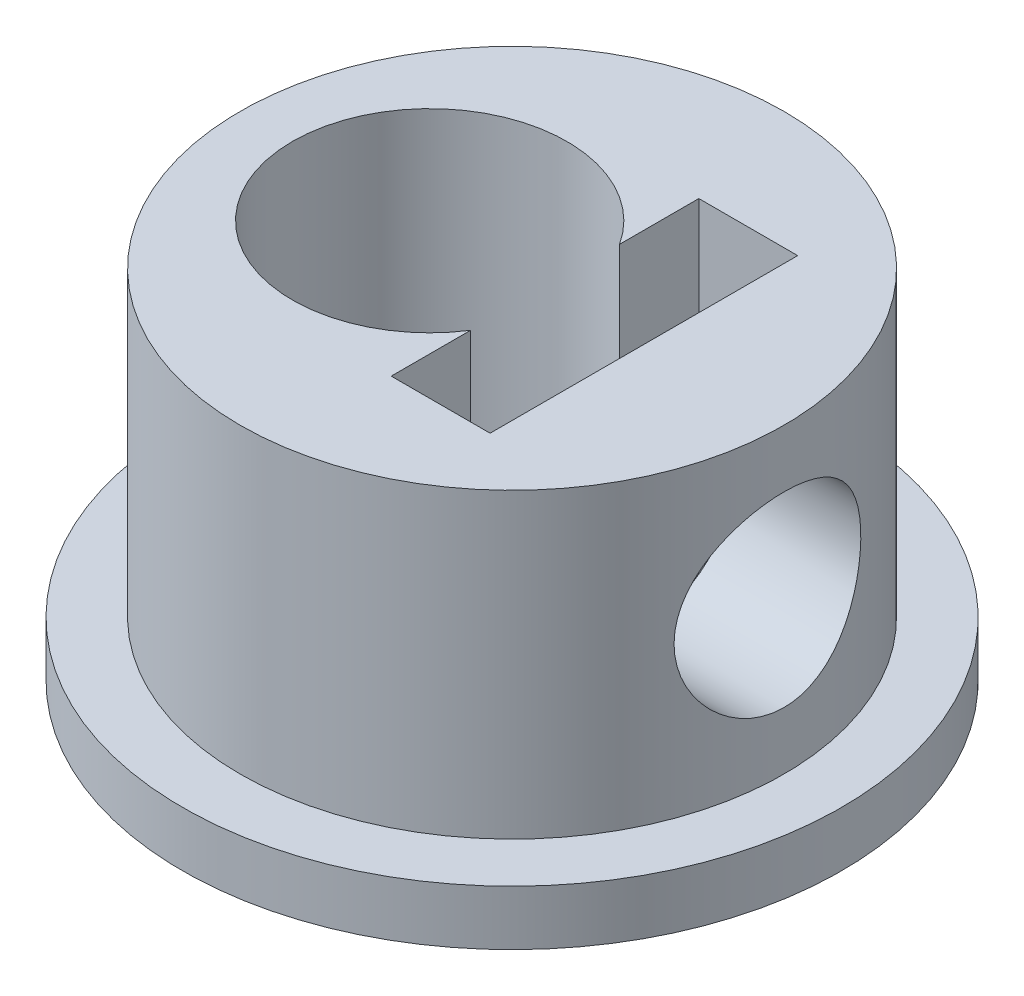
ISO-10303-21;
HEADER;
FILE_DESCRIPTION(('STEP AP214'),'2;1');
FILE_NAME('part.step','',(''),(''),'','','');
FILE_SCHEMA(('AUTOMOTIVE_DESIGN { 1 0 10303 214 1 1 1 1 }'));
ENDSEC;
DATA;
#1=APPLICATION_CONTEXT('core data for automotive mechanical design processes');
#2=APPLICATION_PROTOCOL_DEFINITION('international standard','automotive_design',2000,#1);
#3=PRODUCT_CONTEXT('',#1,'mechanical');
#4=PRODUCT('Part','Part','',(#3));
#5=PRODUCT_RELATED_PRODUCT_CATEGORY('part','',(#4));
#6=PRODUCT_DEFINITION_FORMATION('','',#4);
#7=PRODUCT_DEFINITION_CONTEXT('part definition',#1,'design');
#8=PRODUCT_DEFINITION('design','',#6,#7);
#9=PRODUCT_DEFINITION_SHAPE('','',#8);
#10=(LENGTH_UNIT() NAMED_UNIT(*) SI_UNIT(.MILLI.,.METRE.));
#11=(NAMED_UNIT(*) PLANE_ANGLE_UNIT() SI_UNIT($,.RADIAN.));
#12=(NAMED_UNIT(*) SI_UNIT($,.STERADIAN.) SOLID_ANGLE_UNIT());
#13=UNCERTAINTY_MEASURE_WITH_UNIT(LENGTH_MEASURE(1.E-05),#10,'distance_accuracy_value','');
#14=(GEOMETRIC_REPRESENTATION_CONTEXT(3) GLOBAL_UNCERTAINTY_ASSIGNED_CONTEXT((#13)) GLOBAL_UNIT_ASSIGNED_CONTEXT((#10,
#11,#12)) REPRESENTATION_CONTEXT('',''));
#15=CARTESIAN_POINT('',(0.,0.,0.));
#16=DIRECTION('',(0.,0.,1.));
#17=DIRECTION('',(1.,0.,0.));
#18=AXIS2_PLACEMENT_3D('',#15,#16,#17);
#19=CARTESIAN_POINT('',(2.1,26.3821764679411,2.8));
#20=DIRECTION('',(-1.,0.,0.));
#21=DIRECTION('',(0.,0.,1.));
#22=AXIS2_PLACEMENT_3D('',#19,#20,#21);
#23=PLANE('',#22);
#24=DIRECTION('',(0.,0.,-1.));
#25=VECTOR('',#24,1.);
#26=CARTESIAN_POINT('',(2.1,20.5,2.8));
#27=LINE('',#26,#25);
#28=CARTESIAN_POINT('',(2.1,20.5,-1.35646599662505));
#29=VERTEX_POINT('',#28);
#30=CARTESIAN_POINT('',(2.1,20.5,-2.8));
#31=VERTEX_POINT('',#30);
#32=EDGE_CURVE('E96',#29,#31,#27,.T.);
#33=ORIENTED_EDGE('',*,*,#32,.F.);
#34=DIRECTION('',(0.,-1.,0.));
#35=VECTOR('',#34,1.);
#36=CARTESIAN_POINT('',(2.1,20.5,-1.35646599662505));
#37=LINE('',#36,#35);
#38=CARTESIAN_POINT('',(2.1,14.,-1.35646599662505));
#39=VERTEX_POINT('',#38);
#40=EDGE_CURVE('E46',#29,#39,#37,.T.);
#41=ORIENTED_EDGE('',*,*,#40,.T.);
#42=DIRECTION('',(0.,0.,-1.));
#43=VECTOR('',#42,1.);
#44=CARTESIAN_POINT('',(2.1,14.,-1.35646599662505));
#45=LINE('',#44,#43);
#46=CARTESIAN_POINT('',(2.1,14.,-2.8));
#47=VERTEX_POINT('',#46);
#48=EDGE_CURVE('E94',#39,#47,#45,.T.);
#49=ORIENTED_EDGE('',*,*,#48,.T.);
#50=DIRECTION('',(0.,-1.,0.));
#51=VECTOR('',#50,1.);
#52=CARTESIAN_POINT('',(2.1,26.3821764679411,-2.8));
#53=LINE('',#52,#51);
#54=EDGE_CURVE('E141',#31,#47,#53,.T.);
#55=ORIENTED_EDGE('',*,*,#54,.F.);
#56=EDGE_LOOP('',(#33,#41,#49,#55));
#57=FACE_BOUND('',#56,.T.);
#58=ADVANCED_FACE('F33',(#57),#23,.F.);
#59=CARTESIAN_POINT('',(1.5,20.5,0.));
#60=DIRECTION('',(0.,-1.,0.));
#61=DIRECTION('',(0.,0.,-1.));
#62=AXIS2_PLACEMENT_3D('',#59,#60,#61);
#63=CYLINDRICAL_SURFACE('',#62,4.95);
#64=CARTESIAN_POINT('',(6.45,16.05,0.));
#65=CARTESIAN_POINT('',(6.45000069370142,16.0499989798399,0.092596429513226));
#66=CARTESIAN_POINT('',(6.44737813284091,16.0575897978011,0.185185670024593));
#67=CARTESIAN_POINT('',(6.43717535980457,16.0876527224191,0.367627365291267));
#68=CARTESIAN_POINT('',(6.42959493116856,16.1101254788209,0.457479700374191));
#69=CARTESIAN_POINT('',(6.41029780757027,16.1690843806396,0.631791103056447));
#70=CARTESIAN_POINT('',(6.39858828303766,16.2055462427121,0.71625922232293));
#71=CARTESIAN_POINT('',(6.37222131099333,16.2913353579994,0.877880006838769));
#72=CARTESIAN_POINT('',(6.35756322777972,16.3406653862405,0.955031089266111));
#73=CARTESIAN_POINT('',(6.32623675407634,16.4526789666225,1.10264337621929));
#74=CARTESIAN_POINT('',(6.30951809156585,16.5157484444016,1.17280098627916));
#75=CARTESIAN_POINT('',(6.27622427238612,16.6526305175334,1.30177843985447));
#76=CARTESIAN_POINT('',(6.25964915087896,16.7264456704673,1.36059557645195));
#77=CARTESIAN_POINT('',(6.22795876261535,16.885510693191,1.46700047607617));
#78=CARTESIAN_POINT('',(6.21290432882619,16.9710431321208,1.5141857064657));
#79=CARTESIAN_POINT('',(6.18672836691681,17.1494298419942,1.59337043783226));
#80=CARTESIAN_POINT('',(6.1756055541467,17.2422817091776,1.62537490026795));
#81=CARTESIAN_POINT('',(6.15908340545217,17.4292076879648,1.67213664204263));
#82=CARTESIAN_POINT('',(6.15349503542264,17.5231216020063,1.68746546272729));
#83=CARTESIAN_POINT('',(6.14811662727282,17.7123419508981,1.70222780841535));
#84=CARTESIAN_POINT('',(6.14832466478679,17.8076479130961,1.70166660879053));
#85=CARTESIAN_POINT('',(6.15435052254945,17.9919941335364,1.68510700611931));
#86=CARTESIAN_POINT('',(6.15989352709647,18.0811128882059,1.66986482389371));
#87=CARTESIAN_POINT('',(6.17551343933726,18.2554414796757,1.62561341003419));
#88=CARTESIAN_POINT('',(6.18559092132817,18.340650819837,1.59660243454024));
#89=CARTESIAN_POINT('',(6.20933285789689,18.506418241684,1.52516105728235));
#90=CARTESIAN_POINT('',(6.22305477376428,18.5868740299714,1.48251322704317));
#91=CARTESIAN_POINT('',(6.25251653545097,18.7397216127519,1.38515976008882));
#92=CARTESIAN_POINT('',(6.26825699177138,18.8121109551438,1.33045047180914));
#93=CARTESIAN_POINT('',(6.3010525417767,18.9510061333229,1.20693520802176));
#94=CARTESIAN_POINT('',(6.31813205198042,19.0169604928795,1.13751425415935));
#95=CARTESIAN_POINT('',(6.35091825106323,19.1364399225024,0.988389373888792));
#96=CARTESIAN_POINT('',(6.36662479144719,19.1899636491541,0.908684337496531));
#97=CARTESIAN_POINT('',(6.39512419125182,19.2835432996544,0.740029542582821));
#98=CARTESIAN_POINT('',(6.40788278371196,19.3234431816121,0.650987011249475));
#99=CARTESIAN_POINT('',(6.42879893938599,19.3875235440451,0.466909537165199));
#100=CARTESIAN_POINT('',(6.43695820346475,19.411709836025,0.371876824100799));
#101=CARTESIAN_POINT('',(6.44747057679864,19.4426802537318,0.183178965471971));
#102=CARTESIAN_POINT('',(6.45007191719742,19.4502089367143,0.0896496963212941));
#103=CARTESIAN_POINT('',(6.44992508075,19.4497823219202,-0.0973595918798174));
#104=CARTESIAN_POINT('',(6.4471778702919,19.4418298213185,-0.190839616775248));
#105=CARTESIAN_POINT('',(6.43680662035375,19.4112508485353,-0.372061911656081));
#106=CARTESIAN_POINT('',(6.42933692904941,19.3890884937086,-0.459892210673393));
#107=CARTESIAN_POINT('',(6.41042641653269,19.3313063105564,-0.630546831880474));
#108=CARTESIAN_POINT('',(6.39898508386593,19.295684748948,-0.713370507720791));
#109=CARTESIAN_POINT('',(6.37289896440764,19.2109277644608,-0.874170736826442));
#110=CARTESIAN_POINT('',(6.35817562544958,19.161451643662,-0.951954595906774));
#111=CARTESIAN_POINT('',(6.32718626709556,19.0507863596591,-1.09835392155126));
#112=CARTESIAN_POINT('',(6.31091975231965,18.9895934287403,-1.16696642684554));
#113=CARTESIAN_POINT('',(6.27767634213329,18.8537341265165,-1.29653421147232));
#114=CARTESIAN_POINT('',(6.2607031512487,18.7785591491072,-1.35695845566415));
#115=CARTESIAN_POINT('',(6.22875865252161,18.6187772271138,-1.46440906300595));
#116=CARTESIAN_POINT('',(6.21378739211506,18.53417005912,-1.51143510871406));
#117=CARTESIAN_POINT('',(6.18767351162391,18.3577592334269,-1.59058566150042));
#118=CARTESIAN_POINT('',(6.17652764149465,18.2659617664511,-1.62272282630838));
#119=CARTESIAN_POINT('',(6.15952631711939,18.0777819983166,-1.67092203449501));
#120=CARTESIAN_POINT('',(6.15366828277755,17.9814019573274,-1.68699191800119));
#121=CARTESIAN_POINT('',(6.14821121380117,17.7924398644147,-1.70196638340577));
#122=CARTESIAN_POINT('',(6.14828879926044,17.6999366945893,-1.70175782190002));
#123=CARTESIAN_POINT('',(6.15388775556847,17.516358076011,-1.68638493527463));
#124=CARTESIAN_POINT('',(6.15940876306917,17.4252825323764,-1.67122160838461));
#125=CARTESIAN_POINT('',(6.17502466615914,17.2490962564078,-1.62701326020542));
#126=CARTESIAN_POINT('',(6.1850190487905,17.1638995417041,-1.59827256358081));
#127=CARTESIAN_POINT('',(6.20841313050403,16.9994748160653,-1.52797629001649));
#128=CARTESIAN_POINT('',(6.22181361345371,16.920248184512,-1.48641776275743));
#129=CARTESIAN_POINT('',(6.25127503308727,16.7660758043549,-1.38944662276113));
#130=CARTESIAN_POINT('',(6.26742972685762,16.6914924516433,-1.33348654366442));
#131=CARTESIAN_POINT('',(6.3002042364227,16.5524890066147,-1.21020768750438));
#132=CARTESIAN_POINT('',(6.31682418632536,16.4880718809314,-1.14288560668158));
#133=CARTESIAN_POINT('',(6.34950134918466,16.3684728900159,-0.995375273941958));
#134=CARTESIAN_POINT('',(6.36550496036101,16.3137973854236,-0.914763022945991));
#135=CARTESIAN_POINT('',(6.39437907709044,16.218823902565,-0.744954899290544));
#136=CARTESIAN_POINT('',(6.40725015424877,16.1785233006307,-0.655760596781152));
#137=CARTESIAN_POINT('',(6.42813050587441,16.1144978857665,-0.473527978319499));
#138=CARTESIAN_POINT('',(6.43625069316387,16.0903927972109,-0.380636457894556));
#139=CARTESIAN_POINT('',(6.44718423109157,16.0581469393132,-0.191826734468684));
#140=CARTESIAN_POINT('',(6.44999928147809,16.0500010566613,-0.0959095109107316));
#141=CARTESIAN_POINT('',(6.45,16.05,0.));
#142=B_SPLINE_CURVE_WITH_KNOTS('',3,(#64,#65,#66,#67,#68,#69,#70,#71,#72,#73,#74,#75,#76,#77,
#78,#79,#80,#81,#82,#83,#84,#85,#86,#87,#88,#89,#90,#91,#92,#93,#94,#95,#96,#97,#98,#99,#100,
#101,#102,#103,#104,#105,#106,#107,#108,#109,#110,#111,#112,#113,#114,#115,#116,#117,#118,#119,
#120,#121,#122,#123,#124,#125,#126,#127,#128,#129,#130,#131,#132,#133,#134,#135,#136,#137,#138,
#139,#140,#141),.UNSPECIFIED.,.T.,.F.,(4,2,2,2,2,2,2,2,2,2,2,2,2,2,2,2,2,2,2,2,2,2,2,2,2,2,2,2,
2,2,2,2,2,2,2,2,2,2,4),(0.,0.277436146896723,0.554884407446291,0.831853215644849,
1.10888180175117,1.39502435475455,1.68123512431986,1.97627797841328,2.27122433849064,
2.55570798137313,2.84009717885187,3.11057975141463,3.38109659057285,3.65616181186757,
3.93131042283743,4.22176858483785,4.51225812290531,4.80597119541188,5.09957557932481,
5.37976628043744,5.65990636076749,5.9313328822991,6.20279437018311,6.48162730436674,
6.76055005247461,7.05296674062304,7.34539035638801,7.63756491098153,7.92959682754577,
8.20573044873868,8.48184563927765,8.75204603224331,9.02230866453332,9.30495266300707,
9.58767898867258,9.88237326593628,10.1770137288452,10.4644685998547,10.7518313556079),.UNSPECIFIED.);
#143=CARTESIAN_POINT('',(6.45,16.05,0.));
#144=VERTEX_POINT('',#143);
#145=EDGE_CURVE('E11',#144,#144,#142,.T.);
#146=ORIENTED_EDGE('',*,*,#145,.T.);
#147=EDGE_LOOP('',(#146));
#148=FACE_BOUND('',#147,.T.);
#149=CARTESIAN_POINT('',(1.5,20.5,0.));
#150=DIRECTION('',(0.,1.,0.));
#151=DIRECTION('',(0.,0.,1.));
#152=AXIS2_PLACEMENT_3D('',#149,#150,#151);
#153=CIRCLE('',#152,4.95);
#154=CARTESIAN_POINT('',(1.5,20.5,4.95));
#155=VERTEX_POINT('',#154);
#156=EDGE_CURVE('E149',#155,#155,#153,.T.);
#157=ORIENTED_EDGE('',*,*,#156,.F.);
#158=EDGE_LOOP('',(#157));
#159=FACE_BOUND('',#158,.T.);
#160=CARTESIAN_POINT('',(1.5,15.,0.));
#161=DIRECTION('',(0.,1.,0.));
#162=DIRECTION('',(0.,0.,1.));
#163=AXIS2_PLACEMENT_3D('',#160,#161,#162);
#164=CIRCLE('',#163,4.95);
#165=CARTESIAN_POINT('',(1.5,15.,4.95));
#166=VERTEX_POINT('',#165);
#167=EDGE_CURVE('E123',#166,#166,#164,.T.);
#168=ORIENTED_EDGE('',*,*,#167,.T.);
#169=EDGE_LOOP('',(#168));
#170=FACE_BOUND('',#169,.T.);
#171=ADVANCED_FACE('F35',(#148,#159,#170),#63,.T.);
#172=CARTESIAN_POINT('',(1.5,20.5,0.));
#173=DIRECTION('',(0.,1.,0.));
#174=DIRECTION('',(0.,0.,1.));
#175=AXIS2_PLACEMENT_3D('',#172,#173,#174);
#176=PLANE('',#175);
#177=CARTESIAN_POINT('',(0.,20.5,0.));
#178=DIRECTION('',(0.,-1.,0.));
#179=DIRECTION('',(0.,0.,-1.));
#180=AXIS2_PLACEMENT_3D('',#177,#178,#179);
#181=CIRCLE('',#180,2.5);
#182=CARTESIAN_POINT('',(2.1,20.5,1.35646599662505));
#183=VERTEX_POINT('',#182);
#184=EDGE_CURVE('E53',#183,#29,#181,.T.);
#185=ORIENTED_EDGE('',*,*,#184,.T.);
#186=ORIENTED_EDGE('',*,*,#32,.T.);
#187=DIRECTION('',(1.,0.,0.));
#188=VECTOR('',#187,1.);
#189=CARTESIAN_POINT('',(2.1,20.5,-2.8));
#190=LINE('',#189,#188);
#191=CARTESIAN_POINT('',(3.9,20.5,-2.8));
#192=VERTEX_POINT('',#191);
#193=EDGE_CURVE('E138',#31,#192,#190,.T.);
#194=ORIENTED_EDGE('',*,*,#193,.T.);
#195=DIRECTION('',(0.,0.,1.));
#196=VECTOR('',#195,1.);
#197=CARTESIAN_POINT('',(3.9,20.5,2.8));
#198=LINE('',#197,#196);
#199=CARTESIAN_POINT('',(3.9,20.5,2.8));
#200=VERTEX_POINT('',#199);
#201=EDGE_CURVE('E134',#192,#200,#198,.T.);
#202=ORIENTED_EDGE('',*,*,#201,.T.);
#203=DIRECTION('',(-1.,0.,0.));
#204=VECTOR('',#203,1.);
#205=CARTESIAN_POINT('',(2.1,20.5,2.8));
#206=LINE('',#205,#204);
#207=CARTESIAN_POINT('',(2.1,20.5,2.8));
#208=VERTEX_POINT('',#207);
#209=EDGE_CURVE('E130',#200,#208,#206,.T.);
#210=ORIENTED_EDGE('',*,*,#209,.T.);
#211=EDGE_CURVE('E142',#208,#183,#27,.T.);
#212=ORIENTED_EDGE('',*,*,#211,.T.);
#213=EDGE_LOOP('',(#185,#186,#194,#202,#210,#212));
#214=FACE_BOUND('',#213,.T.);
#215=ORIENTED_EDGE('',*,*,#156,.T.);
#216=EDGE_LOOP('',(#215));
#217=FACE_BOUND('',#216,.T.);
#218=ADVANCED_FACE('F158',(#214,#217),#176,.T.);
#219=CARTESIAN_POINT('',(2.1,26.3821764679411,2.8));
#220=DIRECTION('',(0.,0.,1.));
#221=DIRECTION('',(1.,0.,0.));
#222=AXIS2_PLACEMENT_3D('',#219,#220,#221);
#223=PLANE('',#222);
#224=DIRECTION('',(0.,-1.,0.));
#225=VECTOR('',#224,1.);
#226=CARTESIAN_POINT('',(3.9,26.3821764679411,2.8));
#227=LINE('',#226,#225);
#228=CARTESIAN_POINT('',(3.9,14.,2.8));
#229=VERTEX_POINT('',#228);
#230=EDGE_CURVE('E61',#200,#229,#227,.T.);
#231=ORIENTED_EDGE('',*,*,#230,.T.);
#232=DIRECTION('',(-1.,0.,0.));
#233=VECTOR('',#232,1.);
#234=CARTESIAN_POINT('',(3.9,14.,2.8));
#235=LINE('',#234,#233);
#236=CARTESIAN_POINT('',(2.1,14.,2.8));
#237=VERTEX_POINT('',#236);
#238=EDGE_CURVE('E114',#229,#237,#235,.T.);
#239=ORIENTED_EDGE('',*,*,#238,.T.);
#240=DIRECTION('',(0.,-1.,0.));
#241=VECTOR('',#240,1.);
#242=CARTESIAN_POINT('',(2.1,26.3821764679411,2.8));
#243=LINE('',#242,#241);
#244=EDGE_CURVE('E133',#208,#237,#243,.T.);
#245=ORIENTED_EDGE('',*,*,#244,.F.);
#246=ORIENTED_EDGE('',*,*,#209,.F.);
#247=EDGE_LOOP('',(#231,#239,#245,#246));
#248=FACE_BOUND('',#247,.T.);
#249=ADVANCED_FACE('F161',(#248),#223,.F.);
#250=ORIENTED_EDGE('',*,*,#244,.T.);
#251=DIRECTION('',(0.,0.,-1.));
#252=VECTOR('',#251,1.);
#253=CARTESIAN_POINT('',(2.1,14.,2.8));
#254=LINE('',#253,#252);
#255=CARTESIAN_POINT('',(2.1,14.,1.35646599662505));
#256=VERTEX_POINT('',#255);
#257=EDGE_CURVE('E117',#237,#256,#254,.T.);
#258=ORIENTED_EDGE('',*,*,#257,.T.);
#259=DIRECTION('',(0.,-1.,0.));
#260=VECTOR('',#259,1.);
#261=CARTESIAN_POINT('',(2.1,20.5,1.35646599662505));
#262=LINE('',#261,#260);
#263=EDGE_CURVE('E97',#256,#183,#262,.F.);
#264=ORIENTED_EDGE('',*,*,#263,.T.);
#265=ORIENTED_EDGE('',*,*,#211,.F.);
#266=EDGE_LOOP('',(#250,#258,#264,#265));
#267=FACE_BOUND('',#266,.T.);
#268=ADVANCED_FACE('F155',(#267),#23,.F.);
#269=CARTESIAN_POINT('',(2.1,26.3821764679411,-2.8));
#270=DIRECTION('',(0.,0.,-1.));
#271=DIRECTION('',(-1.,0.,0.));
#272=AXIS2_PLACEMENT_3D('',#269,#270,#271);
#273=PLANE('',#272);
#274=ORIENTED_EDGE('',*,*,#54,.T.);
#275=DIRECTION('',(1.,0.,0.));
#276=VECTOR('',#275,1.);
#277=CARTESIAN_POINT('',(2.1,14.,-2.8));
#278=LINE('',#277,#276);
#279=CARTESIAN_POINT('',(3.9,14.,-2.8));
#280=VERTEX_POINT('',#279);
#281=EDGE_CURVE('E108',#47,#280,#278,.T.);
#282=ORIENTED_EDGE('',*,*,#281,.T.);
#283=DIRECTION('',(0.,-1.,0.));
#284=VECTOR('',#283,1.);
#285=CARTESIAN_POINT('',(3.9,26.3821764679411,-2.8));
#286=LINE('',#285,#284);
#287=EDGE_CURVE('E137',#192,#280,#286,.T.);
#288=ORIENTED_EDGE('',*,*,#287,.F.);
#289=ORIENTED_EDGE('',*,*,#193,.F.);
#290=EDGE_LOOP('',(#274,#282,#288,#289));
#291=FACE_BOUND('',#290,.T.);
#292=ADVANCED_FACE('F167',(#291),#273,.F.);
#293=CARTESIAN_POINT('',(3.9,26.3821764679411,2.8));
#294=DIRECTION('',(1.,0.,0.));
#295=DIRECTION('',(0.,0.,-1.));
#296=AXIS2_PLACEMENT_3D('',#293,#294,#295);
#297=PLANE('',#296);
#298=CARTESIAN_POINT('',(3.9,17.75,0.));
#299=DIRECTION('',(-1.,0.,0.));
#300=DIRECTION('',(0.,0.,1.));
#301=AXIS2_PLACEMENT_3D('',#298,#299,#300);
#302=CIRCLE('',#301,1.7);
#303=CARTESIAN_POINT('',(3.9,17.75,1.7));
#304=VERTEX_POINT('',#303);
#305=EDGE_CURVE('E126',#304,#304,#302,.T.);
#306=ORIENTED_EDGE('',*,*,#305,.F.);
#307=EDGE_LOOP('',(#306));
#308=FACE_BOUND('',#307,.T.);
#309=ORIENTED_EDGE('',*,*,#287,.T.);
#310=DIRECTION('',(0.,0.,1.));
#311=VECTOR('',#310,1.);
#312=CARTESIAN_POINT('',(3.9,14.,-2.8));
#313=LINE('',#312,#311);
#314=EDGE_CURVE('E110',#280,#229,#313,.T.);
#315=ORIENTED_EDGE('',*,*,#314,.T.);
#316=ORIENTED_EDGE('',*,*,#230,.F.);
#317=ORIENTED_EDGE('',*,*,#201,.F.);
#318=EDGE_LOOP('',(#309,#315,#316,#317));
#319=FACE_BOUND('',#318,.T.);
#320=ADVANCED_FACE('F163',(#308,#319),#297,.F.);
#321=CARTESIAN_POINT('',(0.,20.5,0.));
#322=DIRECTION('',(0.,-1.,0.));
#323=DIRECTION('',(0.,0.,-1.));
#324=AXIS2_PLACEMENT_3D('',#321,#322,#323);
#325=CYLINDRICAL_SURFACE('',#324,2.5);
#326=ORIENTED_EDGE('',*,*,#184,.F.);
#327=ORIENTED_EDGE('',*,*,#263,.F.);
#328=CARTESIAN_POINT('',(0.,14.,0.));
#329=DIRECTION('',(0.,-1.,0.));
#330=DIRECTION('',(0.,0.,-1.));
#331=AXIS2_PLACEMENT_3D('',#328,#329,#330);
#332=CIRCLE('',#331,2.5);
#333=EDGE_CURVE('E99',#256,#39,#332,.T.);
#334=ORIENTED_EDGE('',*,*,#333,.T.);
#335=ORIENTED_EDGE('',*,*,#40,.F.);
#336=EDGE_LOOP('',(#326,#327,#334,#335));
#337=FACE_BOUND('',#336,.T.);
#338=ADVANCED_FACE('F100',(#337),#325,.F.);
#339=CARTESIAN_POINT('',(3.9,17.75,0.));
#340=DIRECTION('',(-1.,0.,0.));
#341=DIRECTION('',(0.,0.,1.));
#342=AXIS2_PLACEMENT_3D('',#339,#340,#341);
#343=CYLINDRICAL_SURFACE('',#342,1.7);
#344=ORIENTED_EDGE('',*,*,#305,.T.);
#345=EDGE_LOOP('',(#344));
#346=FACE_BOUND('',#345,.T.);
#347=ORIENTED_EDGE('',*,*,#145,.F.);
#348=EDGE_LOOP('',(#347));
#349=FACE_BOUND('',#348,.T.);
#350=ADVANCED_FACE('F219',(#346,#349),#343,.F.);
#351=CARTESIAN_POINT('',(1.5,14.,0.));
#352=DIRECTION('',(0.,-1.,0.));
#353=DIRECTION('',(0.,0.,-1.));
#354=AXIS2_PLACEMENT_3D('',#351,#352,#353);
#355=PLANE('',#354);
#356=CARTESIAN_POINT('',(1.5,14.,0.));
#357=DIRECTION('',(0.,-1.,0.));
#358=DIRECTION('',(0.,0.,-1.));
#359=AXIS2_PLACEMENT_3D('',#356,#357,#358);
#360=CIRCLE('',#359,6.);
#361=CARTESIAN_POINT('',(1.5,14.,-6.));
#362=VERTEX_POINT('',#361);
#363=EDGE_CURVE('E120',#362,#362,#360,.T.);
#364=ORIENTED_EDGE('',*,*,#363,.T.);
#365=EDGE_LOOP('',(#364));
#366=FACE_BOUND('',#365,.T.);
#367=ORIENTED_EDGE('',*,*,#48,.F.);
#368=ORIENTED_EDGE('',*,*,#333,.F.);
#369=ORIENTED_EDGE('',*,*,#257,.F.);
#370=ORIENTED_EDGE('',*,*,#238,.F.);
#371=ORIENTED_EDGE('',*,*,#314,.F.);
#372=ORIENTED_EDGE('',*,*,#281,.F.);
#373=EDGE_LOOP('',(#367,#368,#369,#370,#371,#372));
#374=FACE_BOUND('',#373,.T.);
#375=ADVANCED_FACE('F105',(#366,#374),#355,.T.);
#376=CARTESIAN_POINT('',(1.5,15.,0.));
#377=DIRECTION('',(0.,-1.,0.));
#378=DIRECTION('',(0.,0.,-1.));
#379=AXIS2_PLACEMENT_3D('',#376,#377,#378);
#380=PLANE('',#379);
#381=ORIENTED_EDGE('',*,*,#167,.F.);
#382=EDGE_LOOP('',(#381));
#383=FACE_BOUND('',#382,.T.);
#384=CARTESIAN_POINT('',(1.5,15.,0.));
#385=DIRECTION('',(0.,-1.,0.));
#386=DIRECTION('',(0.,0.,-1.));
#387=AXIS2_PLACEMENT_3D('',#384,#385,#386);
#388=CIRCLE('',#387,6.);
#389=CARTESIAN_POINT('',(1.5,15.,-6.));
#390=VERTEX_POINT('',#389);
#391=EDGE_CURVE('E119',#390,#390,#388,.T.);
#392=ORIENTED_EDGE('',*,*,#391,.F.);
#393=EDGE_LOOP('',(#392));
#394=FACE_BOUND('',#393,.T.);
#395=ADVANCED_FACE('F230',(#383,#394),#380,.F.);
#396=CARTESIAN_POINT('',(1.5,14.,0.));
#397=DIRECTION('',(0.,1.,0.));
#398=DIRECTION('',(0.,0.,1.));
#399=AXIS2_PLACEMENT_3D('',#396,#397,#398);
#400=CYLINDRICAL_SURFACE('',#399,6.);
#401=ORIENTED_EDGE('',*,*,#363,.F.);
#402=EDGE_LOOP('',(#401));
#403=FACE_BOUND('',#402,.T.);
#404=ORIENTED_EDGE('',*,*,#391,.T.);
#405=EDGE_LOOP('',(#404));
#406=FACE_BOUND('',#405,.T.);
#407=ADVANCED_FACE('F240',(#403,#406),#400,.T.);
#408=CLOSED_SHELL('',(#58,#171,#218,#249,#268,#292,#320,#338,#350,#375,#395,#407));
#409=MANIFOLD_SOLID_BREP('B2',#408);
#410=ADVANCED_BREP_SHAPE_REPRESENTATION('',(#18,#409),#14);
#411=SHAPE_DEFINITION_REPRESENTATION(#9,#410);
ENDSEC;
END-ISO-10303-21;
